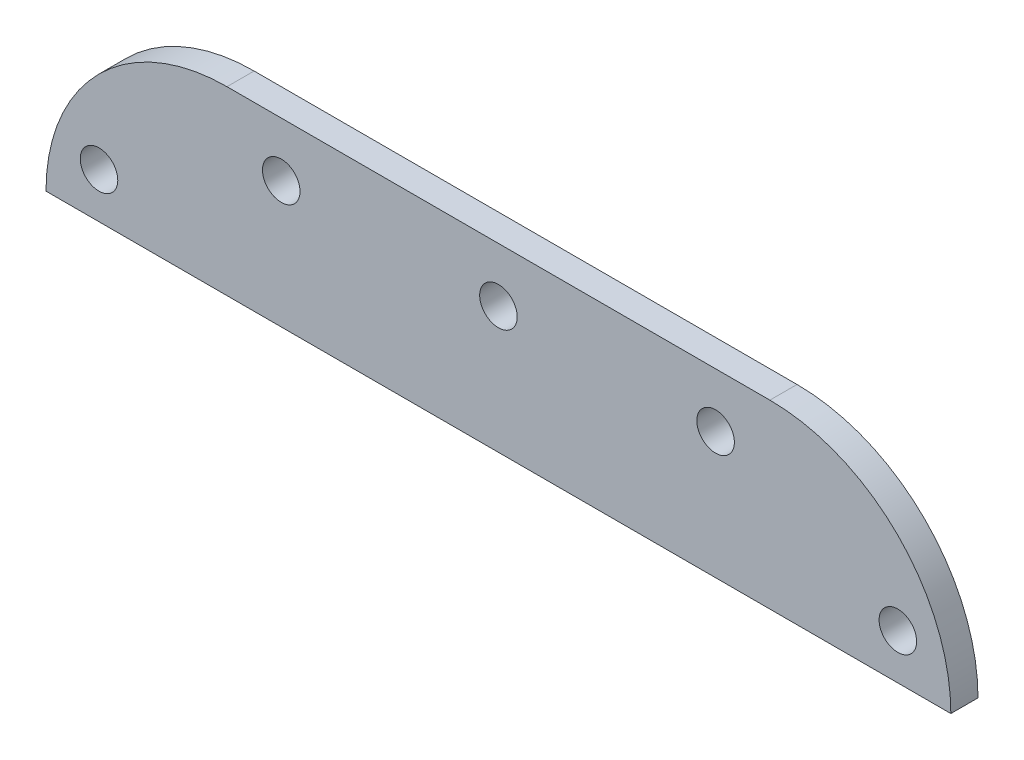
ISO-10303-21;
HEADER;
FILE_DESCRIPTION(('STEP AP214'),'2;1');
FILE_NAME('part.step','',(''),(''),'','','');
FILE_SCHEMA(('AUTOMOTIVE_DESIGN { 1 0 10303 214 1 1 1 1 }'));
ENDSEC;
DATA;
#1=APPLICATION_CONTEXT('core data for automotive mechanical design processes');
#2=APPLICATION_PROTOCOL_DEFINITION('international standard','automotive_design',2000,#1);
#3=PRODUCT_CONTEXT('',#1,'mechanical');
#4=PRODUCT('Part','Part','',(#3));
#5=PRODUCT_RELATED_PRODUCT_CATEGORY('part','',(#4));
#6=PRODUCT_DEFINITION_FORMATION('','',#4);
#7=PRODUCT_DEFINITION_CONTEXT('part definition',#1,'design');
#8=PRODUCT_DEFINITION('design','',#6,#7);
#9=PRODUCT_DEFINITION_SHAPE('','',#8);
#10=(LENGTH_UNIT() NAMED_UNIT(*) SI_UNIT(.MILLI.,.METRE.));
#11=(NAMED_UNIT(*) PLANE_ANGLE_UNIT() SI_UNIT($,.RADIAN.));
#12=(NAMED_UNIT(*) SI_UNIT($,.STERADIAN.) SOLID_ANGLE_UNIT());
#13=UNCERTAINTY_MEASURE_WITH_UNIT(LENGTH_MEASURE(1.E-05),#10,'distance_accuracy_value','');
#14=(GEOMETRIC_REPRESENTATION_CONTEXT(3) GLOBAL_UNCERTAINTY_ASSIGNED_CONTEXT((#13)) GLOBAL_UNIT_ASSIGNED_CONTEXT((#10,
#11,#12)) REPRESENTATION_CONTEXT('',''));
#15=CARTESIAN_POINT('',(0.,0.,0.));
#16=DIRECTION('',(0.,0.,1.));
#17=DIRECTION('',(1.,0.,0.));
#18=AXIS2_PLACEMENT_3D('',#15,#16,#17);
#19=CARTESIAN_POINT('',(60.0000000000001,-20.,6.));
#20=DIRECTION('',(0.,0.,-1.));
#21=DIRECTION('',(-1.,0.,0.));
#22=AXIS2_PLACEMENT_3D('',#19,#20,#21);
#23=PLANE('',#22);
#24=CARTESIAN_POINT('',(60.0000000000001,-20.,6.));
#25=DIRECTION('',(0.,0.,1.));
#26=DIRECTION('',(-1.,0.,0.));
#27=AXIS2_PLACEMENT_3D('',#24,#25,#26);
#28=CIRCLE('',#27,40.);
#29=CARTESIAN_POINT('',(100.,-20.,6.));
#30=VERTEX_POINT('',#29);
#31=CARTESIAN_POINT('',(60.0000000000001,20.,6.));
#32=VERTEX_POINT('',#31);
#33=EDGE_CURVE('E85',#30,#32,#28,.T.);
#34=ORIENTED_EDGE('',*,*,#33,.T.);
#35=DIRECTION('',(-1.,0.,0.));
#36=VECTOR('',#35,1.);
#37=CARTESIAN_POINT('',(-60.0000000000001,20.,6.));
#38=LINE('',#37,#36);
#39=CARTESIAN_POINT('',(-60.0000000000001,20.,6.));
#40=VERTEX_POINT('',#39);
#41=EDGE_CURVE('E80',#32,#40,#38,.T.);
#42=ORIENTED_EDGE('',*,*,#41,.T.);
#43=CARTESIAN_POINT('',(-60.0000000000001,-20.,6.));
#44=DIRECTION('',(0.,0.,1.));
#45=DIRECTION('',(1.,0.,0.));
#46=AXIS2_PLACEMENT_3D('',#43,#44,#45);
#47=CIRCLE('',#46,40.);
#48=CARTESIAN_POINT('',(-100.,-20.,6.));
#49=VERTEX_POINT('',#48);
#50=EDGE_CURVE('E83',#40,#49,#47,.T.);
#51=ORIENTED_EDGE('',*,*,#50,.T.);
#52=DIRECTION('',(1.,0.,0.));
#53=VECTOR('',#52,1.);
#54=CARTESIAN_POINT('',(-100.,-20.,6.));
#55=LINE('',#54,#53);
#56=EDGE_CURVE('E50',#49,#30,#55,.T.);
#57=ORIENTED_EDGE('',*,*,#56,.T.);
#58=EDGE_LOOP('',(#34,#42,#51,#57));
#59=FACE_BOUND('',#58,.T.);
#60=CARTESIAN_POINT('',(0.,8.,6.));
#61=DIRECTION('',(0.,0.,1.));
#62=DIRECTION('',(1.,0.,0.));
#63=AXIS2_PLACEMENT_3D('',#60,#61,#62);
#64=CIRCLE('',#63,4.15);
#65=CARTESIAN_POINT('',(4.15,8.,6.));
#66=VERTEX_POINT('',#65);
#67=EDGE_CURVE('E100',#66,#66,#64,.T.);
#68=ORIENTED_EDGE('',*,*,#67,.F.);
#69=EDGE_LOOP('',(#68));
#70=FACE_BOUND('',#69,.T.);
#71=CARTESIAN_POINT('',(48.,8.,6.));
#72=DIRECTION('',(0.,0.,1.));
#73=DIRECTION('',(1.,0.,0.));
#74=AXIS2_PLACEMENT_3D('',#71,#72,#73);
#75=CIRCLE('',#74,4.15);
#76=CARTESIAN_POINT('',(52.15,8.,6.));
#77=VERTEX_POINT('',#76);
#78=EDGE_CURVE('E115',#77,#77,#75,.T.);
#79=ORIENTED_EDGE('',*,*,#78,.F.);
#80=EDGE_LOOP('',(#79));
#81=FACE_BOUND('',#80,.T.);
#82=CARTESIAN_POINT('',(-48.,8.,6.));
#83=DIRECTION('',(0.,0.,1.));
#84=DIRECTION('',(1.,0.,0.));
#85=AXIS2_PLACEMENT_3D('',#82,#83,#84);
#86=CIRCLE('',#85,4.15);
#87=CARTESIAN_POINT('',(-43.85,8.,6.));
#88=VERTEX_POINT('',#87);
#89=EDGE_CURVE('E121',#88,#88,#86,.T.);
#90=ORIENTED_EDGE('',*,*,#89,.F.);
#91=EDGE_LOOP('',(#90));
#92=FACE_BOUND('',#91,.T.);
#93=CARTESIAN_POINT('',(-88.284271247462,-10.,6.));
#94=DIRECTION('',(0.,0.,1.));
#95=DIRECTION('',(1.,0.,0.));
#96=AXIS2_PLACEMENT_3D('',#93,#94,#95);
#97=CIRCLE('',#96,4.15);
#98=CARTESIAN_POINT('',(-84.134271247462,-10.,6.));
#99=VERTEX_POINT('',#98);
#100=EDGE_CURVE('E127',#99,#99,#97,.T.);
#101=ORIENTED_EDGE('',*,*,#100,.F.);
#102=EDGE_LOOP('',(#101));
#103=FACE_BOUND('',#102,.T.);
#104=CARTESIAN_POINT('',(88.284271247462,-10.,6.));
#105=DIRECTION('',(0.,0.,1.));
#106=DIRECTION('',(1.,0.,0.));
#107=AXIS2_PLACEMENT_3D('',#104,#105,#106);
#108=CIRCLE('',#107,4.15);
#109=CARTESIAN_POINT('',(92.434271247462,-10.,6.));
#110=VERTEX_POINT('',#109);
#111=EDGE_CURVE('E133',#110,#110,#108,.T.);
#112=ORIENTED_EDGE('',*,*,#111,.F.);
#113=EDGE_LOOP('',(#112));
#114=FACE_BOUND('',#113,.T.);
#115=ADVANCED_FACE('F33',(#59,#70,#81,#92,#103,#114),#23,.F.);
#116=CARTESIAN_POINT('',(60.0000000000001,-20.,0.));
#117=DIRECTION('',(0.,0.,-1.));
#118=DIRECTION('',(-1.,0.,0.));
#119=AXIS2_PLACEMENT_3D('',#116,#117,#118);
#120=PLANE('',#119);
#121=CARTESIAN_POINT('',(-88.284271247462,-10.,0.));
#122=DIRECTION('',(0.,0.,1.));
#123=DIRECTION('',(1.,0.,0.));
#124=AXIS2_PLACEMENT_3D('',#121,#122,#123);
#125=CIRCLE('',#124,4.15);
#126=CARTESIAN_POINT('',(-84.134271247462,-10.,0.));
#127=VERTEX_POINT('',#126);
#128=EDGE_CURVE('E130',#127,#127,#125,.T.);
#129=ORIENTED_EDGE('',*,*,#128,.T.);
#130=EDGE_LOOP('',(#129));
#131=FACE_BOUND('',#130,.T.);
#132=CARTESIAN_POINT('',(48.,8.,0.));
#133=DIRECTION('',(0.,0.,1.));
#134=DIRECTION('',(1.,0.,0.));
#135=AXIS2_PLACEMENT_3D('',#132,#133,#134);
#136=CIRCLE('',#135,4.15);
#137=CARTESIAN_POINT('',(52.15,8.,0.));
#138=VERTEX_POINT('',#137);
#139=EDGE_CURVE('E118',#138,#138,#136,.T.);
#140=ORIENTED_EDGE('',*,*,#139,.T.);
#141=EDGE_LOOP('',(#140));
#142=FACE_BOUND('',#141,.T.);
#143=CARTESIAN_POINT('',(60.0000000000001,-20.,0.));
#144=DIRECTION('',(0.,0.,1.));
#145=DIRECTION('',(-1.,0.,0.));
#146=AXIS2_PLACEMENT_3D('',#143,#144,#145);
#147=CIRCLE('',#146,40.);
#148=CARTESIAN_POINT('',(100.,-20.,0.));
#149=VERTEX_POINT('',#148);
#150=CARTESIAN_POINT('',(60.0000000000001,20.,0.));
#151=VERTEX_POINT('',#150);
#152=EDGE_CURVE('E97',#149,#151,#147,.T.);
#153=ORIENTED_EDGE('',*,*,#152,.F.);
#154=DIRECTION('',(1.,0.,0.));
#155=VECTOR('',#154,1.);
#156=CARTESIAN_POINT('',(-100.,-20.,0.));
#157=LINE('',#156,#155);
#158=CARTESIAN_POINT('',(-100.,-20.,0.));
#159=VERTEX_POINT('',#158);
#160=EDGE_CURVE('E73',#159,#149,#157,.T.);
#161=ORIENTED_EDGE('',*,*,#160,.F.);
#162=CARTESIAN_POINT('',(-60.0000000000001,-20.,0.));
#163=DIRECTION('',(0.,0.,1.));
#164=DIRECTION('',(1.,0.,0.));
#165=AXIS2_PLACEMENT_3D('',#162,#163,#164);
#166=CIRCLE('',#165,40.);
#167=CARTESIAN_POINT('',(-60.0000000000001,20.,0.));
#168=VERTEX_POINT('',#167);
#169=EDGE_CURVE('E67',#168,#159,#166,.T.);
#170=ORIENTED_EDGE('',*,*,#169,.F.);
#171=DIRECTION('',(-1.,0.,0.));
#172=VECTOR('',#171,1.);
#173=CARTESIAN_POINT('',(-60.0000000000001,20.,0.));
#174=LINE('',#173,#172);
#175=EDGE_CURVE('E89',#151,#168,#174,.T.);
#176=ORIENTED_EDGE('',*,*,#175,.F.);
#177=EDGE_LOOP('',(#153,#161,#170,#176));
#178=FACE_BOUND('',#177,.T.);
#179=CARTESIAN_POINT('',(0.,8.,0.));
#180=DIRECTION('',(0.,0.,1.));
#181=DIRECTION('',(1.,0.,0.));
#182=AXIS2_PLACEMENT_3D('',#179,#180,#181);
#183=CIRCLE('',#182,4.15);
#184=CARTESIAN_POINT('',(4.15,8.,0.));
#185=VERTEX_POINT('',#184);
#186=EDGE_CURVE('E112',#185,#185,#183,.T.);
#187=ORIENTED_EDGE('',*,*,#186,.T.);
#188=EDGE_LOOP('',(#187));
#189=FACE_BOUND('',#188,.T.);
#190=CARTESIAN_POINT('',(-48.,8.,0.));
#191=DIRECTION('',(0.,0.,1.));
#192=DIRECTION('',(1.,0.,0.));
#193=AXIS2_PLACEMENT_3D('',#190,#191,#192);
#194=CIRCLE('',#193,4.15);
#195=CARTESIAN_POINT('',(-43.85,8.,0.));
#196=VERTEX_POINT('',#195);
#197=EDGE_CURVE('E124',#196,#196,#194,.T.);
#198=ORIENTED_EDGE('',*,*,#197,.T.);
#199=EDGE_LOOP('',(#198));
#200=FACE_BOUND('',#199,.T.);
#201=CARTESIAN_POINT('',(88.284271247462,-10.,0.));
#202=DIRECTION('',(0.,0.,1.));
#203=DIRECTION('',(1.,0.,0.));
#204=AXIS2_PLACEMENT_3D('',#201,#202,#203);
#205=CIRCLE('',#204,4.15);
#206=CARTESIAN_POINT('',(92.434271247462,-10.,0.));
#207=VERTEX_POINT('',#206);
#208=EDGE_CURVE('E136',#207,#207,#205,.T.);
#209=ORIENTED_EDGE('',*,*,#208,.T.);
#210=EDGE_LOOP('',(#209));
#211=FACE_BOUND('',#210,.T.);
#212=ADVANCED_FACE('F108',(#131,#142,#178,#189,#200,#211),#120,.T.);
#213=CARTESIAN_POINT('',(60.0000000000001,-20.,6.));
#214=DIRECTION('',(0.,0.,-1.));
#215=DIRECTION('',(-1.,0.,0.));
#216=AXIS2_PLACEMENT_3D('',#213,#214,#215);
#217=CYLINDRICAL_SURFACE('',#216,40.);
#218=ORIENTED_EDGE('',*,*,#152,.T.);
#219=DIRECTION('',(0.,0.,-1.));
#220=VECTOR('',#219,1.);
#221=CARTESIAN_POINT('',(60.0000000000001,20.,6.));
#222=LINE('',#221,#220);
#223=EDGE_CURVE('E11',#32,#151,#222,.T.);
#224=ORIENTED_EDGE('',*,*,#223,.F.);
#225=ORIENTED_EDGE('',*,*,#33,.F.);
#226=DIRECTION('',(0.,0.,-1.));
#227=VECTOR('',#226,1.);
#228=CARTESIAN_POINT('',(100.,-20.,6.));
#229=LINE('',#228,#227);
#230=EDGE_CURVE('E93',#30,#149,#229,.T.);
#231=ORIENTED_EDGE('',*,*,#230,.T.);
#232=EDGE_LOOP('',(#218,#224,#225,#231));
#233=FACE_BOUND('',#232,.T.);
#234=ADVANCED_FACE('F35',(#233),#217,.T.);
#235=CARTESIAN_POINT('',(-60.0000000000001,20.,6.));
#236=DIRECTION('',(0.,-1.,0.));
#237=DIRECTION('',(0.,0.,-1.));
#238=AXIS2_PLACEMENT_3D('',#235,#236,#237);
#239=PLANE('',#238);
#240=ORIENTED_EDGE('',*,*,#175,.T.);
#241=DIRECTION('',(0.,0.,-1.));
#242=VECTOR('',#241,1.);
#243=CARTESIAN_POINT('',(-60.0000000000001,20.,6.));
#244=LINE('',#243,#242);
#245=EDGE_CURVE('E42',#40,#168,#244,.T.);
#246=ORIENTED_EDGE('',*,*,#245,.F.);
#247=ORIENTED_EDGE('',*,*,#41,.F.);
#248=ORIENTED_EDGE('',*,*,#223,.T.);
#249=EDGE_LOOP('',(#240,#246,#247,#248));
#250=FACE_BOUND('',#249,.T.);
#251=ADVANCED_FACE('F88',(#250),#239,.F.);
#252=CARTESIAN_POINT('',(-60.0000000000001,-20.,6.));
#253=DIRECTION('',(0.,0.,-1.));
#254=DIRECTION('',(-1.,0.,0.));
#255=AXIS2_PLACEMENT_3D('',#252,#253,#254);
#256=CYLINDRICAL_SURFACE('',#255,40.);
#257=ORIENTED_EDGE('',*,*,#169,.T.);
#258=DIRECTION('',(0.,0.,-1.));
#259=VECTOR('',#258,1.);
#260=CARTESIAN_POINT('',(-100.,-20.,6.));
#261=LINE('',#260,#259);
#262=EDGE_CURVE('E90',#49,#159,#261,.T.);
#263=ORIENTED_EDGE('',*,*,#262,.F.);
#264=ORIENTED_EDGE('',*,*,#50,.F.);
#265=ORIENTED_EDGE('',*,*,#245,.T.);
#266=EDGE_LOOP('',(#257,#263,#264,#265));
#267=FACE_BOUND('',#266,.T.);
#268=ADVANCED_FACE('F91',(#267),#256,.T.);
#269=CARTESIAN_POINT('',(-100.,-20.,6.));
#270=DIRECTION('',(0.,1.,0.));
#271=DIRECTION('',(0.,0.,1.));
#272=AXIS2_PLACEMENT_3D('',#269,#270,#271);
#273=PLANE('',#272);
#274=ORIENTED_EDGE('',*,*,#160,.T.);
#275=ORIENTED_EDGE('',*,*,#230,.F.);
#276=ORIENTED_EDGE('',*,*,#56,.F.);
#277=ORIENTED_EDGE('',*,*,#262,.T.);
#278=EDGE_LOOP('',(#274,#275,#276,#277));
#279=FACE_BOUND('',#278,.T.);
#280=ADVANCED_FACE('F105',(#279),#273,.F.);
#281=CARTESIAN_POINT('',(0.,8.,6.));
#282=DIRECTION('',(0.,0.,-1.));
#283=DIRECTION('',(-1.,0.,0.));
#284=AXIS2_PLACEMENT_3D('',#281,#282,#283);
#285=CYLINDRICAL_SURFACE('',#284,4.15);
#286=ORIENTED_EDGE('',*,*,#67,.T.);
#287=EDGE_LOOP('',(#286));
#288=FACE_BOUND('',#287,.T.);
#289=ORIENTED_EDGE('',*,*,#186,.F.);
#290=EDGE_LOOP('',(#289));
#291=FACE_BOUND('',#290,.T.);
#292=ADVANCED_FACE('F153',(#288,#291),#285,.F.);
#293=CARTESIAN_POINT('',(48.,8.,6.));
#294=DIRECTION('',(0.,0.,-1.));
#295=DIRECTION('',(-1.,0.,0.));
#296=AXIS2_PLACEMENT_3D('',#293,#294,#295);
#297=CYLINDRICAL_SURFACE('',#296,4.15);
#298=ORIENTED_EDGE('',*,*,#78,.T.);
#299=EDGE_LOOP('',(#298));
#300=FACE_BOUND('',#299,.T.);
#301=ORIENTED_EDGE('',*,*,#139,.F.);
#302=EDGE_LOOP('',(#301));
#303=FACE_BOUND('',#302,.T.);
#304=ADVANCED_FACE('F199',(#300,#303),#297,.F.);
#305=CARTESIAN_POINT('',(-48.,8.,6.));
#306=DIRECTION('',(0.,0.,-1.));
#307=DIRECTION('',(-1.,0.,0.));
#308=AXIS2_PLACEMENT_3D('',#305,#306,#307);
#309=CYLINDRICAL_SURFACE('',#308,4.15);
#310=ORIENTED_EDGE('',*,*,#89,.T.);
#311=EDGE_LOOP('',(#310));
#312=FACE_BOUND('',#311,.T.);
#313=ORIENTED_EDGE('',*,*,#197,.F.);
#314=EDGE_LOOP('',(#313));
#315=FACE_BOUND('',#314,.T.);
#316=ADVANCED_FACE('F207',(#312,#315),#309,.F.);
#317=CARTESIAN_POINT('',(-88.284271247462,-10.,6.));
#318=DIRECTION('',(0.,0.,-1.));
#319=DIRECTION('',(-1.,0.,0.));
#320=AXIS2_PLACEMENT_3D('',#317,#318,#319);
#321=CYLINDRICAL_SURFACE('',#320,4.15);
#322=ORIENTED_EDGE('',*,*,#100,.T.);
#323=EDGE_LOOP('',(#322));
#324=FACE_BOUND('',#323,.T.);
#325=ORIENTED_EDGE('',*,*,#128,.F.);
#326=EDGE_LOOP('',(#325));
#327=FACE_BOUND('',#326,.T.);
#328=ADVANCED_FACE('F215',(#324,#327),#321,.F.);
#329=CARTESIAN_POINT('',(88.284271247462,-10.,6.));
#330=DIRECTION('',(0.,0.,-1.));
#331=DIRECTION('',(-1.,0.,0.));
#332=AXIS2_PLACEMENT_3D('',#329,#330,#331);
#333=CYLINDRICAL_SURFACE('',#332,4.15);
#334=ORIENTED_EDGE('',*,*,#111,.T.);
#335=EDGE_LOOP('',(#334));
#336=FACE_BOUND('',#335,.T.);
#337=ORIENTED_EDGE('',*,*,#208,.F.);
#338=EDGE_LOOP('',(#337));
#339=FACE_BOUND('',#338,.T.);
#340=ADVANCED_FACE('F142',(#336,#339),#333,.F.);
#341=CLOSED_SHELL('',(#115,#212,#234,#251,#268,#280,#292,#304,#316,#328,#340));
#342=MANIFOLD_SOLID_BREP('B2',#341);
#343=ADVANCED_BREP_SHAPE_REPRESENTATION('',(#18,#342),#14);
#344=SHAPE_DEFINITION_REPRESENTATION(#9,#343);
ENDSEC;
END-ISO-10303-21;
